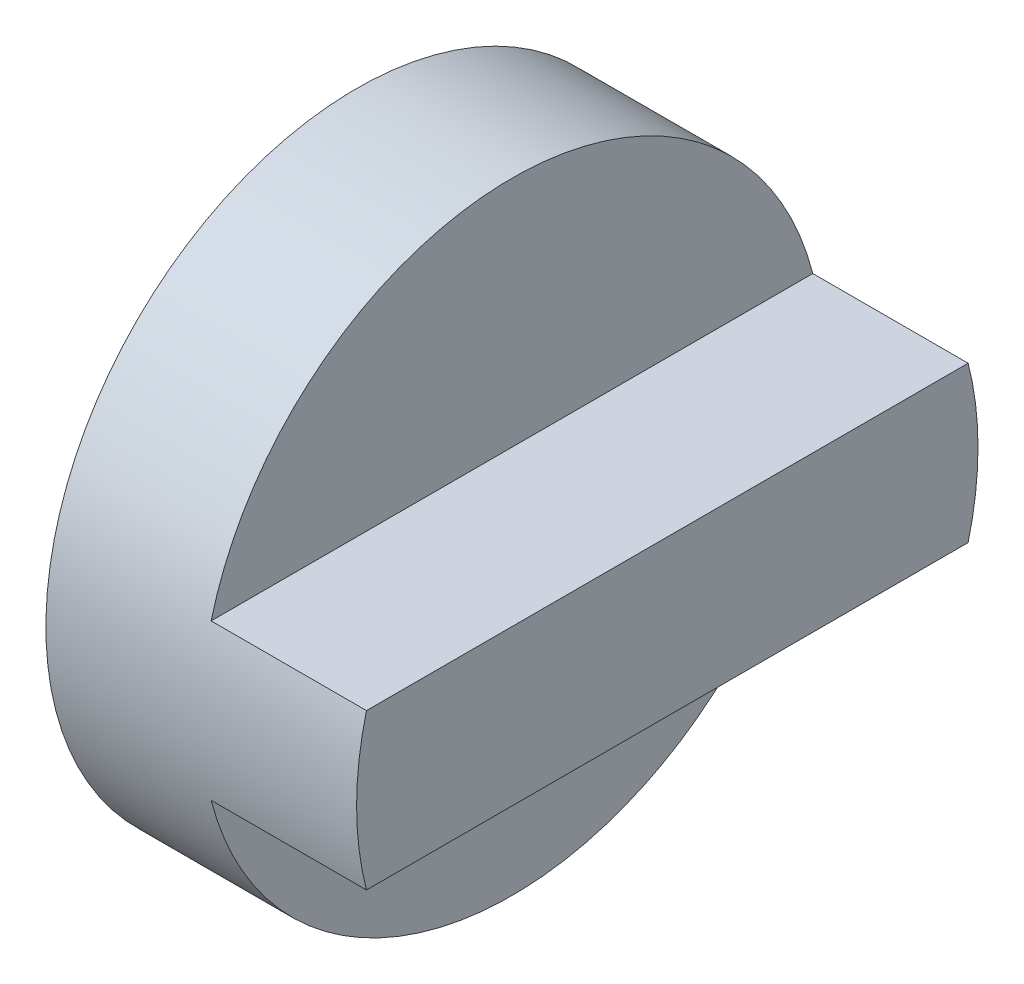
ISO-10303-21;
HEADER;
FILE_DESCRIPTION(('STEP AP214'),'2;1');
FILE_NAME('part.step','',(''),(''),'','','');
FILE_SCHEMA(('AUTOMOTIVE_DESIGN { 1 0 10303 214 1 1 1 1 }'));
ENDSEC;
DATA;
#1=APPLICATION_CONTEXT('core data for automotive mechanical design processes');
#2=APPLICATION_PROTOCOL_DEFINITION('international standard','automotive_design',2000,#1);
#3=PRODUCT_CONTEXT('',#1,'mechanical');
#4=PRODUCT('Part','Part','',(#3));
#5=PRODUCT_RELATED_PRODUCT_CATEGORY('part','',(#4));
#6=PRODUCT_DEFINITION_FORMATION('','',#4);
#7=PRODUCT_DEFINITION_CONTEXT('part definition',#1,'design');
#8=PRODUCT_DEFINITION('design','',#6,#7);
#9=PRODUCT_DEFINITION_SHAPE('','',#8);
#10=(LENGTH_UNIT() NAMED_UNIT(*) SI_UNIT(.MILLI.,.METRE.));
#11=(NAMED_UNIT(*) PLANE_ANGLE_UNIT() SI_UNIT($,.RADIAN.));
#12=(NAMED_UNIT(*) SI_UNIT($,.STERADIAN.) SOLID_ANGLE_UNIT());
#13=UNCERTAINTY_MEASURE_WITH_UNIT(LENGTH_MEASURE(1.E-05),#10,'distance_accuracy_value','');
#14=(GEOMETRIC_REPRESENTATION_CONTEXT(3) GLOBAL_UNCERTAINTY_ASSIGNED_CONTEXT((#13)) GLOBAL_UNIT_ASSIGNED_CONTEXT((#10,
#11,#12)) REPRESENTATION_CONTEXT('',''));
#15=CARTESIAN_POINT('',(0.,0.,0.));
#16=DIRECTION('',(0.,0.,1.));
#17=DIRECTION('',(1.,0.,0.));
#18=AXIS2_PLACEMENT_3D('',#15,#16,#17);
#19=CARTESIAN_POINT('',(10.,0.,0.));
#20=DIRECTION('',(1.,0.,0.));
#21=DIRECTION('',(0.,0.,-1.));
#22=AXIS2_PLACEMENT_3D('',#19,#20,#21);
#23=PLANE('',#22);
#24=DIRECTION('',(0.,0.,-1.));
#25=VECTOR('',#24,1.);
#26=CARTESIAN_POINT('',(10.,-5.,19.3649167310371));
#27=LINE('',#26,#25);
#28=CARTESIAN_POINT('',(10.,-5.,19.3649167310371));
#29=VERTEX_POINT('',#28);
#30=CARTESIAN_POINT('',(10.,-5.,-19.3649167310371));
#31=VERTEX_POINT('',#30);
#32=EDGE_CURVE('E57',#29,#31,#27,.T.);
#33=ORIENTED_EDGE('',*,*,#32,.F.);
#34=CARTESIAN_POINT('',(10.,0.,0.));
#35=DIRECTION('',(1.,0.,0.));
#36=DIRECTION('',(0.,0.,-1.));
#37=AXIS2_PLACEMENT_3D('',#34,#35,#36);
#38=CIRCLE('',#37,20.);
#39=EDGE_CURVE('E49',#29,#31,#38,.T.);
#40=ORIENTED_EDGE('',*,*,#39,.T.);
#41=EDGE_LOOP('',(#33,#40));
#42=FACE_BOUND('',#41,.T.);
#43=ADVANCED_FACE('F39',(#42),#23,.T.);
#44=CARTESIAN_POINT('',(10.,0.,0.));
#45=DIRECTION('',(-1.,0.,0.));
#46=DIRECTION('',(0.,0.,1.));
#47=AXIS2_PLACEMENT_3D('',#44,#45,#46);
#48=CYLINDRICAL_SURFACE('',#47,20.);
#49=CARTESIAN_POINT('',(10.,5.,-19.3649167310371));
#50=VERTEX_POINT('',#49);
#51=CARTESIAN_POINT('',(10.,5.,19.3649167310371));
#52=VERTEX_POINT('',#51);
#53=EDGE_CURVE('E11',#50,#52,#38,.T.);
#54=ORIENTED_EDGE('',*,*,#53,.F.);
#55=DIRECTION('',(-1.,0.,0.));
#56=VECTOR('',#55,1.);
#57=CARTESIAN_POINT('',(20.,5.,-19.3649167310371));
#58=LINE('',#57,#56);
#59=CARTESIAN_POINT('',(20.,5.,-19.3649167310371));
#60=VERTEX_POINT('',#59);
#61=EDGE_CURVE('E82',#60,#50,#58,.T.);
#62=ORIENTED_EDGE('',*,*,#61,.F.);
#63=CARTESIAN_POINT('',(20.,0.,0.));
#64=DIRECTION('',(1.,0.,0.));
#65=DIRECTION('',(0.,0.,-1.));
#66=AXIS2_PLACEMENT_3D('',#63,#64,#65);
#67=CIRCLE('',#66,20.);
#68=CARTESIAN_POINT('',(20.,-5.,-19.3649167310371));
#69=VERTEX_POINT('',#68);
#70=EDGE_CURVE('E89',#69,#60,#67,.T.);
#71=ORIENTED_EDGE('',*,*,#70,.F.);
#72=DIRECTION('',(-1.,0.,0.));
#73=VECTOR('',#72,1.);
#74=CARTESIAN_POINT('',(20.,-5.,-19.3649167310371));
#75=LINE('',#74,#73);
#76=EDGE_CURVE('E113',#69,#31,#75,.T.);
#77=ORIENTED_EDGE('',*,*,#76,.T.);
#78=ORIENTED_EDGE('',*,*,#39,.F.);
#79=DIRECTION('',(-1.,0.,0.));
#80=VECTOR('',#79,1.);
#81=CARTESIAN_POINT('',(20.,-4.99999999999999,19.3649167310371));
#82=LINE('',#81,#80);
#83=CARTESIAN_POINT('',(20.,-4.99999999999999,19.3649167310371));
#84=VERTEX_POINT('',#83);
#85=EDGE_CURVE('E107',#84,#29,#82,.T.);
#86=ORIENTED_EDGE('',*,*,#85,.F.);
#87=CARTESIAN_POINT('',(20.,0.,0.));
#88=DIRECTION('',(1.,0.,0.));
#89=DIRECTION('',(0.,0.,-1.));
#90=AXIS2_PLACEMENT_3D('',#87,#88,#89);
#91=CIRCLE('',#90,20.);
#92=CARTESIAN_POINT('',(20.,5.,19.3649167310371));
#93=VERTEX_POINT('',#92);
#94=EDGE_CURVE('E88',#93,#84,#91,.T.);
#95=ORIENTED_EDGE('',*,*,#94,.F.);
#96=DIRECTION('',(-1.,0.,0.));
#97=VECTOR('',#96,1.);
#98=CARTESIAN_POINT('',(20.,5.,19.3649167310371));
#99=LINE('',#98,#97);
#100=EDGE_CURVE('E84',#93,#52,#99,.T.);
#101=ORIENTED_EDGE('',*,*,#100,.T.);
#102=EDGE_LOOP('',(#54,#62,#71,#77,#78,#86,#95,#101));
#103=FACE_BOUND('',#102,.T.);
#104=CARTESIAN_POINT('',(0.,0.,0.));
#105=DIRECTION('',(1.,0.,0.));
#106=DIRECTION('',(0.,0.,-1.));
#107=AXIS2_PLACEMENT_3D('',#104,#105,#106);
#108=CIRCLE('',#107,20.);
#109=CARTESIAN_POINT('',(0.,0.,-20.));
#110=VERTEX_POINT('',#109);
#111=EDGE_CURVE('E43',#110,#110,#108,.T.);
#112=ORIENTED_EDGE('',*,*,#111,.T.);
#113=EDGE_LOOP('',(#112));
#114=FACE_BOUND('',#113,.T.);
#115=ADVANCED_FACE('F41',(#103,#114),#48,.T.);
#116=DIRECTION('',(0.,0.,1.));
#117=VECTOR('',#116,1.);
#118=CARTESIAN_POINT('',(10.,5.,-19.3649167310371));
#119=LINE('',#118,#117);
#120=EDGE_CURVE('E118',#50,#52,#119,.T.);
#121=ORIENTED_EDGE('',*,*,#120,.F.);
#122=ORIENTED_EDGE('',*,*,#53,.T.);
#123=EDGE_LOOP('',(#121,#122));
#124=FACE_BOUND('',#123,.T.);
#125=ADVANCED_FACE('F138',(#124),#23,.T.);
#126=CARTESIAN_POINT('',(0.,0.,0.));
#127=DIRECTION('',(1.,0.,0.));
#128=DIRECTION('',(0.,0.,-1.));
#129=AXIS2_PLACEMENT_3D('',#126,#127,#128);
#130=PLANE('',#129);
#131=ORIENTED_EDGE('',*,*,#111,.F.);
#132=EDGE_LOOP('',(#131));
#133=FACE_BOUND('',#132,.T.);
#134=ADVANCED_FACE('F134',(#133),#130,.F.);
#135=CARTESIAN_POINT('',(20.,5.,-19.3649167310371));
#136=DIRECTION('',(0.,-1.,0.));
#137=DIRECTION('',(0.,0.,-1.));
#138=AXIS2_PLACEMENT_3D('',#135,#136,#137);
#139=PLANE('',#138);
#140=ORIENTED_EDGE('',*,*,#120,.T.);
#141=ORIENTED_EDGE('',*,*,#100,.F.);
#142=DIRECTION('',(0.,0.,1.));
#143=VECTOR('',#142,1.);
#144=CARTESIAN_POINT('',(20.,5.,-19.3649167310371));
#145=LINE('',#144,#143);
#146=EDGE_CURVE('E77',#60,#93,#145,.T.);
#147=ORIENTED_EDGE('',*,*,#146,.F.);
#148=ORIENTED_EDGE('',*,*,#61,.T.);
#149=EDGE_LOOP('',(#140,#141,#147,#148));
#150=FACE_BOUND('',#149,.T.);
#151=ADVANCED_FACE('F80',(#150),#139,.F.);
#152=CARTESIAN_POINT('',(20.,-5.,19.3649167310371));
#153=DIRECTION('',(0.,1.,0.));
#154=DIRECTION('',(0.,0.,1.));
#155=AXIS2_PLACEMENT_3D('',#152,#153,#154);
#156=PLANE('',#155);
#157=ORIENTED_EDGE('',*,*,#32,.T.);
#158=ORIENTED_EDGE('',*,*,#76,.F.);
#159=DIRECTION('',(0.,0.,-1.));
#160=VECTOR('',#159,1.);
#161=CARTESIAN_POINT('',(20.,-5.,19.3649167310371));
#162=LINE('',#161,#160);
#163=EDGE_CURVE('E94',#84,#69,#162,.T.);
#164=ORIENTED_EDGE('',*,*,#163,.F.);
#165=ORIENTED_EDGE('',*,*,#85,.T.);
#166=EDGE_LOOP('',(#157,#158,#164,#165));
#167=FACE_BOUND('',#166,.T.);
#168=ADVANCED_FACE('F126',(#167),#156,.F.);
#169=CARTESIAN_POINT('',(20.,0.,0.));
#170=DIRECTION('',(1.,0.,0.));
#171=DIRECTION('',(0.,0.,-1.));
#172=AXIS2_PLACEMENT_3D('',#169,#170,#171);
#173=PLANE('',#172);
#174=ORIENTED_EDGE('',*,*,#70,.T.);
#175=ORIENTED_EDGE('',*,*,#146,.T.);
#176=ORIENTED_EDGE('',*,*,#94,.T.);
#177=ORIENTED_EDGE('',*,*,#163,.T.);
#178=EDGE_LOOP('',(#174,#175,#176,#177));
#179=FACE_BOUND('',#178,.T.);
#180=ADVANCED_FACE('F92',(#179),#173,.T.);
#181=CLOSED_SHELL('',(#43,#115,#125,#134,#151,#168,#180));
#182=MANIFOLD_SOLID_BREP('B2',#181);
#183=ADVANCED_BREP_SHAPE_REPRESENTATION('',(#18,#182),#14);
#184=SHAPE_DEFINITION_REPRESENTATION(#9,#183);
ENDSEC;
END-ISO-10303-21;
